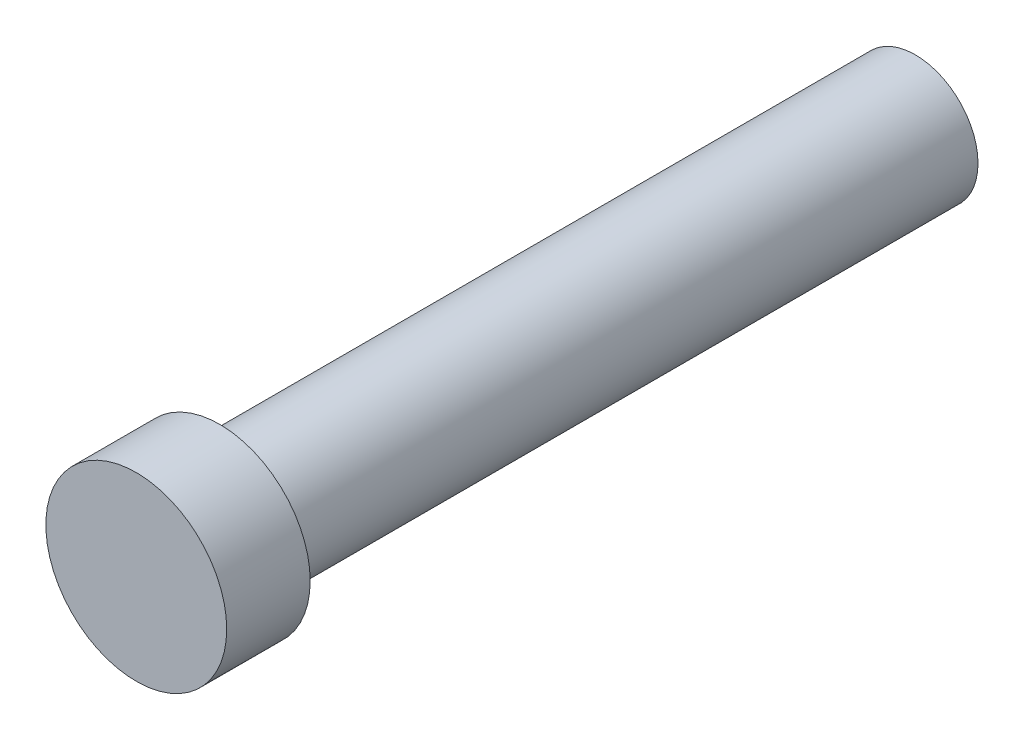
ISO-10303-21;
HEADER;
FILE_DESCRIPTION(('STEP AP214'),'2;1');
FILE_NAME('part.step','',(''),(''),'','','');
FILE_SCHEMA(('AUTOMOTIVE_DESIGN { 1 0 10303 214 1 1 1 1 }'));
ENDSEC;
DATA;
#1=APPLICATION_CONTEXT('core data for automotive mechanical design processes');
#2=APPLICATION_PROTOCOL_DEFINITION('international standard','automotive_design',2000,#1);
#3=PRODUCT_CONTEXT('',#1,'mechanical');
#4=PRODUCT('Part','Part','',(#3));
#5=PRODUCT_RELATED_PRODUCT_CATEGORY('part','',(#4));
#6=PRODUCT_DEFINITION_FORMATION('','',#4);
#7=PRODUCT_DEFINITION_CONTEXT('part definition',#1,'design');
#8=PRODUCT_DEFINITION('design','',#6,#7);
#9=PRODUCT_DEFINITION_SHAPE('','',#8);
#10=(LENGTH_UNIT() NAMED_UNIT(*) SI_UNIT(.MILLI.,.METRE.));
#11=(NAMED_UNIT(*) PLANE_ANGLE_UNIT() SI_UNIT($,.RADIAN.));
#12=(NAMED_UNIT(*) SI_UNIT($,.STERADIAN.) SOLID_ANGLE_UNIT());
#13=UNCERTAINTY_MEASURE_WITH_UNIT(LENGTH_MEASURE(1.E-05),#10,'distance_accuracy_value','');
#14=(GEOMETRIC_REPRESENTATION_CONTEXT(3) GLOBAL_UNCERTAINTY_ASSIGNED_CONTEXT((#13)) GLOBAL_UNIT_ASSIGNED_CONTEXT((#10,
#11,#12)) REPRESENTATION_CONTEXT('',''));
#15=CARTESIAN_POINT('',(0.,0.,0.));
#16=DIRECTION('',(0.,0.,1.));
#17=DIRECTION('',(1.,0.,0.));
#18=AXIS2_PLACEMENT_3D('',#15,#16,#17);
#19=CARTESIAN_POINT('',(0.,0.,0.));
#20=DIRECTION('',(0.,0.,1.));
#21=DIRECTION('',(1.,0.,0.));
#22=AXIS2_PLACEMENT_3D('',#19,#20,#21);
#23=PLANE('',#22);
#24=CARTESIAN_POINT('',(0.,0.,0.));
#25=DIRECTION('',(0.,0.,1.));
#26=DIRECTION('',(1.,0.,0.));
#27=AXIS2_PLACEMENT_3D('',#24,#25,#26);
#28=CIRCLE('',#27,2.25);
#29=CARTESIAN_POINT('',(2.25,0.,0.));
#30=VERTEX_POINT('',#29);
#31=EDGE_CURVE('E41',#30,#30,#28,.T.);
#32=ORIENTED_EDGE('',*,*,#31,.F.);
#33=EDGE_LOOP('',(#32));
#34=FACE_BOUND('',#33,.T.);
#35=ADVANCED_FACE('F37',(#34),#23,.F.);
#36=CARTESIAN_POINT('',(0.,0.,25.));
#37=DIRECTION('',(0.,0.,-1.));
#38=DIRECTION('',(-1.,0.,0.));
#39=AXIS2_PLACEMENT_3D('',#36,#37,#38);
#40=CYLINDRICAL_SURFACE('',#39,2.25);
#41=CARTESIAN_POINT('',(0.,0.,25.));
#42=DIRECTION('',(0.,0.,1.));
#43=DIRECTION('',(1.,0.,0.));
#44=AXIS2_PLACEMENT_3D('',#41,#42,#43);
#45=CIRCLE('',#44,2.25);
#46=CARTESIAN_POINT('',(2.25,0.,25.));
#47=VERTEX_POINT('',#46);
#48=EDGE_CURVE('E11',#47,#47,#45,.T.);
#49=ORIENTED_EDGE('',*,*,#48,.F.);
#50=EDGE_LOOP('',(#49));
#51=FACE_BOUND('',#50,.T.);
#52=ORIENTED_EDGE('',*,*,#31,.T.);
#53=EDGE_LOOP('',(#52));
#54=FACE_BOUND('',#53,.T.);
#55=ADVANCED_FACE('F39',(#51,#54),#40,.T.);
#56=CARTESIAN_POINT('',(0.,0.,28.));
#57=DIRECTION('',(0.,0.,-1.));
#58=DIRECTION('',(-1.,0.,0.));
#59=AXIS2_PLACEMENT_3D('',#56,#57,#58);
#60=CYLINDRICAL_SURFACE('',#59,3.25);
#61=CARTESIAN_POINT('',(0.,0.,28.));
#62=DIRECTION('',(0.,0.,1.));
#63=DIRECTION('',(1.,0.,0.));
#64=AXIS2_PLACEMENT_3D('',#61,#62,#63);
#65=CIRCLE('',#64,3.25);
#66=CARTESIAN_POINT('',(3.25,0.,28.));
#67=VERTEX_POINT('',#66);
#68=EDGE_CURVE('E48',#67,#67,#65,.T.);
#69=ORIENTED_EDGE('',*,*,#68,.F.);
#70=EDGE_LOOP('',(#69));
#71=FACE_BOUND('',#70,.T.);
#72=CARTESIAN_POINT('',(0.,0.,25.));
#73=DIRECTION('',(0.,0.,1.));
#74=DIRECTION('',(1.,0.,0.));
#75=AXIS2_PLACEMENT_3D('',#72,#73,#74);
#76=CIRCLE('',#75,3.25);
#77=CARTESIAN_POINT('',(3.25,0.,25.));
#78=VERTEX_POINT('',#77);
#79=EDGE_CURVE('E50',#78,#78,#76,.T.);
#80=ORIENTED_EDGE('',*,*,#79,.T.);
#81=EDGE_LOOP('',(#80));
#82=FACE_BOUND('',#81,.T.);
#83=ADVANCED_FACE('F58',(#71,#82),#60,.T.);
#84=CARTESIAN_POINT('',(0.,0.,28.));
#85=DIRECTION('',(0.,0.,1.));
#86=DIRECTION('',(1.,0.,0.));
#87=AXIS2_PLACEMENT_3D('',#84,#85,#86);
#88=PLANE('',#87);
#89=ORIENTED_EDGE('',*,*,#68,.T.);
#90=EDGE_LOOP('',(#89));
#91=FACE_BOUND('',#90,.T.);
#92=ADVANCED_FACE('F56',(#91),#88,.T.);
#93=CARTESIAN_POINT('',(0.,0.,25.));
#94=DIRECTION('',(0.,0.,1.));
#95=DIRECTION('',(1.,0.,0.));
#96=AXIS2_PLACEMENT_3D('',#93,#94,#95);
#97=PLANE('',#96);
#98=ORIENTED_EDGE('',*,*,#48,.T.);
#99=EDGE_LOOP('',(#98));
#100=FACE_BOUND('',#99,.T.);
#101=ORIENTED_EDGE('',*,*,#79,.F.);
#102=EDGE_LOOP('',(#101));
#103=FACE_BOUND('',#102,.T.);
#104=ADVANCED_FACE('F64',(#100,#103),#97,.F.);
#105=CLOSED_SHELL('',(#35,#55,#83,#92,#104));
#106=MANIFOLD_SOLID_BREP('B2',#105);
#107=ADVANCED_BREP_SHAPE_REPRESENTATION('',(#18,#106),#14);
#108=SHAPE_DEFINITION_REPRESENTATION(#9,#107);
ENDSEC;
END-ISO-10303-21;
